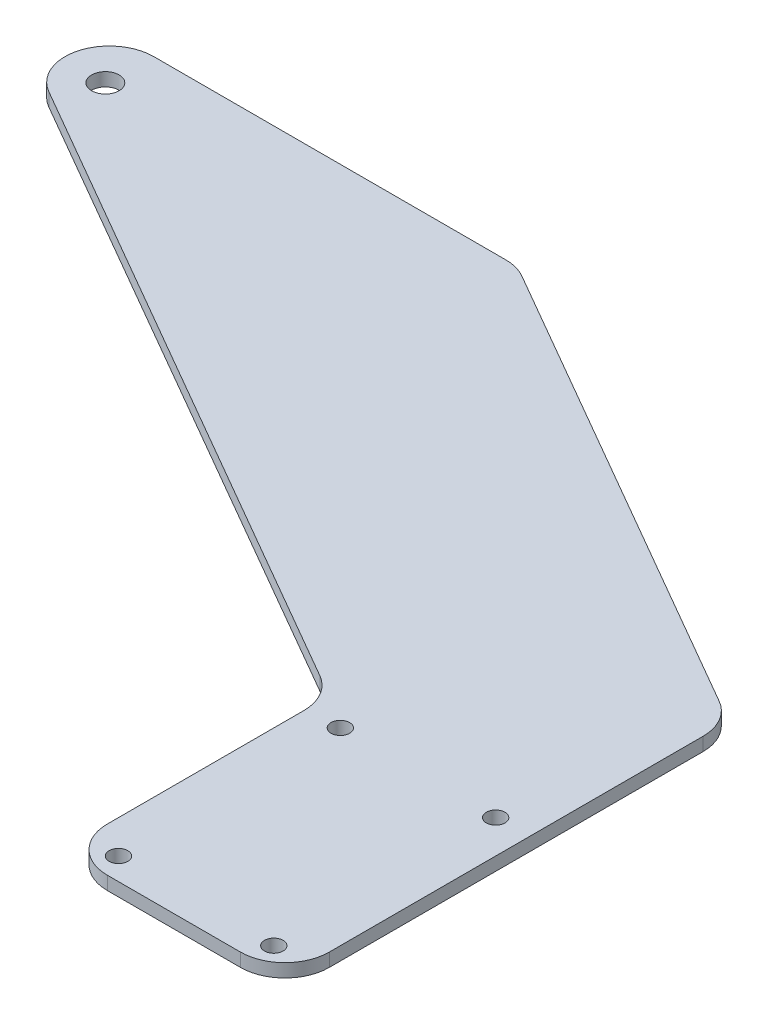
ISO-10303-21;
HEADER;
FILE_DESCRIPTION(('STEP AP214'),'2;1');
FILE_NAME('part.step','',(''),(''),'','','');
FILE_SCHEMA(('AUTOMOTIVE_DESIGN { 1 0 10303 214 1 1 1 1 }'));
ENDSEC;
DATA;
#1=APPLICATION_CONTEXT('core data for automotive mechanical design processes');
#2=APPLICATION_PROTOCOL_DEFINITION('international standard','automotive_design',2000,#1);
#3=PRODUCT_CONTEXT('',#1,'mechanical');
#4=PRODUCT('Part','Part','',(#3));
#5=PRODUCT_RELATED_PRODUCT_CATEGORY('part','',(#4));
#6=PRODUCT_DEFINITION_FORMATION('','',#4);
#7=PRODUCT_DEFINITION_CONTEXT('part definition',#1,'design');
#8=PRODUCT_DEFINITION('design','',#6,#7);
#9=PRODUCT_DEFINITION_SHAPE('','',#8);
#10=(LENGTH_UNIT() NAMED_UNIT(*) SI_UNIT(.MILLI.,.METRE.));
#11=(NAMED_UNIT(*) PLANE_ANGLE_UNIT() SI_UNIT($,.RADIAN.));
#12=(NAMED_UNIT(*) SI_UNIT($,.STERADIAN.) SOLID_ANGLE_UNIT());
#13=UNCERTAINTY_MEASURE_WITH_UNIT(LENGTH_MEASURE(1.E-05),#10,'distance_accuracy_value','');
#14=(GEOMETRIC_REPRESENTATION_CONTEXT(3) GLOBAL_UNCERTAINTY_ASSIGNED_CONTEXT((#13)) GLOBAL_UNIT_ASSIGNED_CONTEXT((#10,
#11,#12)) REPRESENTATION_CONTEXT('',''));
#15=CARTESIAN_POINT('',(0.,0.,0.));
#16=DIRECTION('',(0.,0.,1.));
#17=DIRECTION('',(1.,0.,0.));
#18=AXIS2_PLACEMENT_3D('',#15,#16,#17);
#19=CARTESIAN_POINT('',(1.28197512425567E-13,3.,-159.999999999999));
#20=DIRECTION('',(0.,0.,-1.));
#21=DIRECTION('',(-1.,0.,0.));
#22=AXIS2_PLACEMENT_3D('',#19,#20,#21);
#23=PLANE('',#22);
#24=DIRECTION('',(1.,0.,0.));
#25=VECTOR('',#24,1.);
#26=CARTESIAN_POINT('',(1.28197512425567E-13,3.,-159.999999999999));
#27=LINE('',#26,#25);
#28=CARTESIAN_POINT('',(-152.044826719044,3.,-159.999999999999));
#29=VERTEX_POINT('',#28);
#30=CARTESIAN_POINT('',(-72.7627944162897,3.,-159.999999999999));
#31=VERTEX_POINT('',#30);
#32=EDGE_CURVE('E254',#29,#31,#27,.T.);
#33=ORIENTED_EDGE('',*,*,#32,.T.);
#34=DIRECTION('',(0.,-1.,0.));
#35=VECTOR('',#34,1.);
#36=CARTESIAN_POINT('',(-72.7627944162897,0.,-159.999999999999));
#37=LINE('',#36,#35);
#38=CARTESIAN_POINT('',(-72.7627944162897,0.,-159.999999999999));
#39=VERTEX_POINT('',#38);
#40=EDGE_CURVE('E188',#31,#39,#37,.T.);
#41=ORIENTED_EDGE('',*,*,#40,.T.);
#42=DIRECTION('',(1.,0.,0.));
#43=VECTOR('',#42,1.);
#44=CARTESIAN_POINT('',(1.28197512425567E-13,0.,-159.999999999999));
#45=LINE('',#44,#43);
#46=CARTESIAN_POINT('',(-152.044826719044,0.,-159.999999999999));
#47=VERTEX_POINT('',#46);
#48=EDGE_CURVE('E235',#47,#39,#45,.T.);
#49=ORIENTED_EDGE('',*,*,#48,.F.);
#50=DIRECTION('',(0.,-1.,0.));
#51=VECTOR('',#50,1.);
#52=CARTESIAN_POINT('',(-152.044826719044,3.,-159.999999999999));
#53=LINE('',#52,#51);
#54=EDGE_CURVE('E186',#47,#29,#53,.F.);
#55=ORIENTED_EDGE('',*,*,#54,.T.);
#56=EDGE_LOOP('',(#33,#41,#49,#55));
#57=FACE_BOUND('',#56,.T.);
#58=ADVANCED_FACE('F37',(#57),#23,.T.);
#59=CARTESIAN_POINT('',(21.9406986040719,3.,-38.0024047358087));
#60=DIRECTION('',(-0.499999999999995,0.,0.866025403784442));
#61=DIRECTION('',(0.866025403784442,0.,0.499999999999995));
#62=AXIS2_PLACEMENT_3D('',#59,#60,#61);
#63=PLANE('',#62);
#64=DIRECTION('',(-0.866025403784442,0.,-0.499999999999995));
#65=VECTOR('',#64,1.);
#66=CARTESIAN_POINT('',(21.9406986040719,0.,-38.0024047358087));
#67=LINE('',#66,#65);
#68=CARTESIAN_POINT('',(-12.5000000000001,0.,-57.8867513459481));
#69=VERTEX_POINT('',#68);
#70=CARTESIAN_POINT('',(-157.044826719044,0.,-141.339745962155));
#71=VERTEX_POINT('',#70);
#72=EDGE_CURVE('E230',#69,#71,#67,.T.);
#73=ORIENTED_EDGE('',*,*,#72,.F.);
#74=DIRECTION('',(0.,-1.,0.));
#75=VECTOR('',#74,1.);
#76=CARTESIAN_POINT('',(-12.5000000000001,3.,-57.8867513459481));
#77=LINE('',#76,#75);
#78=CARTESIAN_POINT('',(-12.5000000000001,3.,-57.8867513459481));
#79=VERTEX_POINT('',#78);
#80=EDGE_CURVE('E184',#69,#79,#77,.F.);
#81=ORIENTED_EDGE('',*,*,#80,.T.);
#82=DIRECTION('',(-0.866025403784442,0.,-0.499999999999995));
#83=VECTOR('',#82,1.);
#84=CARTESIAN_POINT('',(21.9406986040719,3.,-38.0024047358087));
#85=LINE('',#84,#83);
#86=CARTESIAN_POINT('',(-157.044826719044,3.,-141.339745962155));
#87=VERTEX_POINT('',#86);
#88=EDGE_CURVE('E251',#79,#87,#85,.T.);
#89=ORIENTED_EDGE('',*,*,#88,.T.);
#90=DIRECTION('',(0.,-1.,0.));
#91=VECTOR('',#90,1.);
#92=CARTESIAN_POINT('',(-157.044826719044,3.,-141.339745962155));
#93=LINE('',#92,#91);
#94=EDGE_CURVE('E181',#87,#71,#93,.T.);
#95=ORIENTED_EDGE('',*,*,#94,.T.);
#96=EDGE_LOOP('',(#73,#81,#89,#95));
#97=FACE_BOUND('',#96,.T.);
#98=ADVANCED_FACE('F294',(#97),#63,.T.);
#99=CARTESIAN_POINT('',(-7.5,3.,0.));
#100=DIRECTION('',(-1.,0.,0.));
#101=DIRECTION('',(0.,0.,1.));
#102=AXIS2_PLACEMENT_3D('',#99,#100,#101);
#103=PLANE('',#102);
#104=DIRECTION('',(0.,0.,-1.));
#105=VECTOR('',#104,1.);
#106=CARTESIAN_POINT('',(-7.5,0.,0.));
#107=LINE('',#106,#105);
#108=CARTESIAN_POINT('',(-7.5,0.,-5.));
#109=VERTEX_POINT('',#108);
#110=CARTESIAN_POINT('',(-7.5,0.,-49.2264973081037));
#111=VERTEX_POINT('',#110);
#112=EDGE_CURVE('E229',#109,#111,#107,.T.);
#113=ORIENTED_EDGE('',*,*,#112,.F.);
#114=DIRECTION('',(0.,-1.,0.));
#115=VECTOR('',#114,1.);
#116=CARTESIAN_POINT('',(-7.5,3.,-5.));
#117=LINE('',#116,#115);
#118=CARTESIAN_POINT('',(-7.5,3.,-5.));
#119=VERTEX_POINT('',#118);
#120=EDGE_CURVE('E11',#109,#119,#117,.F.);
#121=ORIENTED_EDGE('',*,*,#120,.T.);
#122=DIRECTION('',(0.,0.,-1.));
#123=VECTOR('',#122,1.);
#124=CARTESIAN_POINT('',(-7.5,3.,0.));
#125=LINE('',#124,#123);
#126=CARTESIAN_POINT('',(-7.5,3.,-49.2264973081037));
#127=VERTEX_POINT('',#126);
#128=EDGE_CURVE('E249',#119,#127,#125,.T.);
#129=ORIENTED_EDGE('',*,*,#128,.T.);
#130=DIRECTION('',(0.,-1.,0.));
#131=VECTOR('',#130,1.);
#132=CARTESIAN_POINT('',(-7.5,0.,-49.2264973081037));
#133=LINE('',#132,#131);
#134=EDGE_CURVE('E178',#127,#111,#133,.T.);
#135=ORIENTED_EDGE('',*,*,#134,.T.);
#136=EDGE_LOOP('',(#113,#121,#129,#135));
#137=FACE_BOUND('',#136,.T.);
#138=ADVANCED_FACE('F300',(#137),#103,.T.);
#139=CARTESIAN_POINT('',(0.,3.,5.));
#140=DIRECTION('',(0.,0.,-1.));
#141=DIRECTION('',(-1.,0.,0.));
#142=AXIS2_PLACEMENT_3D('',#139,#140,#141);
#143=PLANE('',#142);
#144=DIRECTION('',(1.,0.,0.));
#145=VECTOR('',#144,1.);
#146=CARTESIAN_POINT('',(0.,0.,5.));
#147=LINE('',#146,#145);
#148=CARTESIAN_POINT('',(2.5,0.,5.));
#149=VERTEX_POINT('',#148);
#150=CARTESIAN_POINT('',(32.5,0.,4.99999999999999));
#151=VERTEX_POINT('',#150);
#152=EDGE_CURVE('E160',#149,#151,#147,.T.);
#153=ORIENTED_EDGE('',*,*,#152,.T.);
#154=DIRECTION('',(0.,-1.,0.));
#155=VECTOR('',#154,1.);
#156=CARTESIAN_POINT('',(32.5,3.,4.99999999999999));
#157=LINE('',#156,#155);
#158=CARTESIAN_POINT('',(32.5,3.,4.99999999999999));
#159=VERTEX_POINT('',#158);
#160=EDGE_CURVE('E58',#151,#159,#157,.F.);
#161=ORIENTED_EDGE('',*,*,#160,.T.);
#162=DIRECTION('',(1.,0.,0.));
#163=VECTOR('',#162,1.);
#164=CARTESIAN_POINT('',(0.,3.,5.));
#165=LINE('',#164,#163);
#166=CARTESIAN_POINT('',(2.5,3.,5.));
#167=VERTEX_POINT('',#166);
#168=EDGE_CURVE('E219',#167,#159,#165,.T.);
#169=ORIENTED_EDGE('',*,*,#168,.F.);
#170=DIRECTION('',(0.,-1.,0.));
#171=VECTOR('',#170,1.);
#172=CARTESIAN_POINT('',(2.5,0.,5.));
#173=LINE('',#172,#171);
#174=EDGE_CURVE('E208',#167,#149,#173,.T.);
#175=ORIENTED_EDGE('',*,*,#174,.T.);
#176=EDGE_LOOP('',(#153,#161,#169,#175));
#177=FACE_BOUND('',#176,.T.);
#178=ADVANCED_FACE('F227',(#177),#143,.F.);
#179=CARTESIAN_POINT('',(42.5,3.,0.));
#180=DIRECTION('',(-1.,0.,0.));
#181=DIRECTION('',(0.,0.,1.));
#182=AXIS2_PLACEMENT_3D('',#179,#180,#181);
#183=PLANE('',#182);
#184=DIRECTION('',(0.,0.,-1.));
#185=VECTOR('',#184,1.);
#186=CARTESIAN_POINT('',(42.5,3.,0.));
#187=LINE('',#186,#185);
#188=CARTESIAN_POINT('',(42.5,3.,-5.00000000000001));
#189=VERTEX_POINT('',#188);
#190=CARTESIAN_POINT('',(42.5,3.,-89.226497308104));
#191=VERTEX_POINT('',#190);
#192=EDGE_CURVE('E218',#189,#191,#187,.T.);
#193=ORIENTED_EDGE('',*,*,#192,.F.);
#194=DIRECTION('',(0.,-1.,0.));
#195=VECTOR('',#194,1.);
#196=CARTESIAN_POINT('',(42.5,3.,-5.00000000000001));
#197=LINE('',#196,#195);
#198=CARTESIAN_POINT('',(42.5,0.,-5.00000000000001));
#199=VERTEX_POINT('',#198);
#200=EDGE_CURVE('E196',#189,#199,#197,.T.);
#201=ORIENTED_EDGE('',*,*,#200,.T.);
#202=DIRECTION('',(0.,0.,-1.));
#203=VECTOR('',#202,1.);
#204=CARTESIAN_POINT('',(42.5,0.,0.));
#205=LINE('',#204,#203);
#206=CARTESIAN_POINT('',(42.5,0.,-89.226497308104));
#207=VERTEX_POINT('',#206);
#208=EDGE_CURVE('E155',#199,#207,#205,.T.);
#209=ORIENTED_EDGE('',*,*,#208,.T.);
#210=DIRECTION('',(0.,-1.,0.));
#211=VECTOR('',#210,1.);
#212=CARTESIAN_POINT('',(42.5,3.,-89.226497308104));
#213=LINE('',#212,#211);
#214=EDGE_CURVE('E134',#207,#191,#213,.F.);
#215=ORIENTED_EDGE('',*,*,#214,.T.);
#216=EDGE_LOOP('',(#193,#201,#209,#215));
#217=FACE_BOUND('',#216,.T.);
#218=ADVANCED_FACE('F223',(#217),#183,.F.);
#219=CARTESIAN_POINT('',(35.,3.,0.));
#220=DIRECTION('',(0.,-1.,0.));
#221=DIRECTION('',(0.,0.,-1.));
#222=AXIS2_PLACEMENT_3D('',#219,#220,#221);
#223=CYLINDRICAL_SURFACE('',#222,2.1);
#224=CARTESIAN_POINT('',(35.,3.,0.));
#225=DIRECTION('',(0.,1.,0.));
#226=DIRECTION('',(0.,0.,1.));
#227=AXIS2_PLACEMENT_3D('',#224,#225,#226);
#228=CIRCLE('',#227,2.1);
#229=CARTESIAN_POINT('',(35.,3.,2.1));
#230=VERTEX_POINT('',#229);
#231=EDGE_CURVE('E244',#230,#230,#228,.T.);
#232=ORIENTED_EDGE('',*,*,#231,.T.);
#233=EDGE_LOOP('',(#232));
#234=FACE_BOUND('',#233,.T.);
#235=CARTESIAN_POINT('',(35.,0.,0.));
#236=DIRECTION('',(0.,1.,0.));
#237=DIRECTION('',(0.,0.,1.));
#238=AXIS2_PLACEMENT_3D('',#235,#236,#237);
#239=CIRCLE('',#238,2.1);
#240=CARTESIAN_POINT('',(35.,0.,2.1));
#241=VERTEX_POINT('',#240);
#242=EDGE_CURVE('E154',#241,#241,#239,.T.);
#243=ORIENTED_EDGE('',*,*,#242,.F.);
#244=EDGE_LOOP('',(#243));
#245=FACE_BOUND('',#244,.T.);
#246=ADVANCED_FACE('F354',(#234,#245),#223,.F.);
#247=CARTESIAN_POINT('',(51.7612066797599,3.,-89.6530398304203));
#248=DIRECTION('',(-0.499999999999989,0.,0.866025403784445));
#249=DIRECTION('',(0.866025403784445,0.,0.499999999999989));
#250=AXIS2_PLACEMENT_3D('',#247,#248,#249);
#251=PLANE('',#250);
#252=DIRECTION('',(-0.866025403784445,0.,-0.499999999999989));
#253=VECTOR('',#252,1.);
#254=CARTESIAN_POINT('',(51.7612066797599,3.,-89.6530398304203));
#255=LINE('',#254,#253);
#256=CARTESIAN_POINT('',(37.4999999999999,3.,-97.8867513459484));
#257=VERTEX_POINT('',#256);
#258=CARTESIAN_POINT('',(-67.7627944162898,3.,-158.660254037844));
#259=VERTEX_POINT('',#258);
#260=EDGE_CURVE('E147',#257,#259,#255,.T.);
#261=ORIENTED_EDGE('',*,*,#260,.F.);
#262=DIRECTION('',(0.,-1.,0.));
#263=VECTOR('',#262,1.);
#264=CARTESIAN_POINT('',(37.4999999999999,3.,-97.8867513459484));
#265=LINE('',#264,#263);
#266=CARTESIAN_POINT('',(37.4999999999999,0.,-97.8867513459484));
#267=VERTEX_POINT('',#266);
#268=EDGE_CURVE('E132',#257,#267,#265,.T.);
#269=ORIENTED_EDGE('',*,*,#268,.T.);
#270=DIRECTION('',(-0.866025403784445,0.,-0.499999999999989));
#271=VECTOR('',#270,1.);
#272=CARTESIAN_POINT('',(51.7612066797599,0.,-89.6530398304203));
#273=LINE('',#272,#271);
#274=CARTESIAN_POINT('',(-67.7627944162898,0.,-158.660254037844));
#275=VERTEX_POINT('',#274);
#276=EDGE_CURVE('E144',#267,#275,#273,.T.);
#277=ORIENTED_EDGE('',*,*,#276,.T.);
#278=DIRECTION('',(0.,-1.,0.));
#279=VECTOR('',#278,1.);
#280=CARTESIAN_POINT('',(-67.7627944162898,3.,-158.660254037844));
#281=LINE('',#280,#279);
#282=EDGE_CURVE('E149',#275,#259,#281,.F.);
#283=ORIENTED_EDGE('',*,*,#282,.T.);
#284=EDGE_LOOP('',(#261,#269,#277,#283));
#285=FACE_BOUND('',#284,.T.);
#286=ADVANCED_FACE('F143',(#285),#251,.F.);
#287=CARTESIAN_POINT('',(0.,3.,-50.));
#288=DIRECTION('',(0.,-1.,0.));
#289=DIRECTION('',(0.,0.,-1.));
#290=AXIS2_PLACEMENT_3D('',#287,#288,#289);
#291=CYLINDRICAL_SURFACE('',#290,2.1);
#292=CARTESIAN_POINT('',(0.,3.,-50.));
#293=DIRECTION('',(0.,1.,0.));
#294=DIRECTION('',(0.,0.,1.));
#295=AXIS2_PLACEMENT_3D('',#292,#293,#294);
#296=CIRCLE('',#295,2.1);
#297=CARTESIAN_POINT('',(0.,3.,-47.9));
#298=VERTEX_POINT('',#297);
#299=EDGE_CURVE('E257',#298,#298,#296,.T.);
#300=ORIENTED_EDGE('',*,*,#299,.T.);
#301=EDGE_LOOP('',(#300));
#302=FACE_BOUND('',#301,.T.);
#303=CARTESIAN_POINT('',(0.,0.,-50.));
#304=DIRECTION('',(0.,1.,0.));
#305=DIRECTION('',(0.,0.,1.));
#306=AXIS2_PLACEMENT_3D('',#303,#304,#305);
#307=CIRCLE('',#306,2.1);
#308=CARTESIAN_POINT('',(0.,0.,-47.9));
#309=VERTEX_POINT('',#308);
#310=EDGE_CURVE('E237',#309,#309,#307,.T.);
#311=ORIENTED_EDGE('',*,*,#310,.F.);
#312=EDGE_LOOP('',(#311));
#313=FACE_BOUND('',#312,.T.);
#314=ADVANCED_FACE('F276',(#302,#313),#291,.F.);
#315=CARTESIAN_POINT('',(35.,3.,-50.));
#316=DIRECTION('',(0.,-1.,0.));
#317=DIRECTION('',(0.,0.,-1.));
#318=AXIS2_PLACEMENT_3D('',#315,#316,#317);
#319=CYLINDRICAL_SURFACE('',#318,2.1);
#320=CARTESIAN_POINT('',(35.,3.,-50.));
#321=DIRECTION('',(0.,1.,0.));
#322=DIRECTION('',(0.,0.,1.));
#323=AXIS2_PLACEMENT_3D('',#320,#321,#322);
#324=CIRCLE('',#323,2.1);
#325=CARTESIAN_POINT('',(35.,3.,-47.9));
#326=VERTEX_POINT('',#325);
#327=EDGE_CURVE('E166',#326,#326,#324,.F.);
#328=ORIENTED_EDGE('',*,*,#327,.F.);
#329=EDGE_LOOP('',(#328));
#330=FACE_BOUND('',#329,.T.);
#331=CARTESIAN_POINT('',(35.,0.,-50.));
#332=DIRECTION('',(0.,1.,0.));
#333=DIRECTION('',(0.,0.,1.));
#334=AXIS2_PLACEMENT_3D('',#331,#332,#333);
#335=CIRCLE('',#334,2.1);
#336=CARTESIAN_POINT('',(35.,0.,-47.9));
#337=VERTEX_POINT('',#336);
#338=EDGE_CURVE('E200',#337,#337,#335,.F.);
#339=ORIENTED_EDGE('',*,*,#338,.T.);
#340=EDGE_LOOP('',(#339));
#341=FACE_BOUND('',#340,.T.);
#342=ADVANCED_FACE('F279',(#330,#341),#319,.F.);
#343=CARTESIAN_POINT('',(0.,3.,0.));
#344=DIRECTION('',(0.,-1.,0.));
#345=DIRECTION('',(0.,0.,-1.));
#346=AXIS2_PLACEMENT_3D('',#343,#344,#345);
#347=CYLINDRICAL_SURFACE('',#346,2.1);
#348=CARTESIAN_POINT('',(0.,3.,0.));
#349=DIRECTION('',(0.,1.,0.));
#350=DIRECTION('',(0.,0.,1.));
#351=AXIS2_PLACEMENT_3D('',#348,#349,#350);
#352=CIRCLE('',#351,2.1);
#353=CARTESIAN_POINT('',(0.,3.,2.1));
#354=VERTEX_POINT('',#353);
#355=EDGE_CURVE('E167',#354,#354,#352,.F.);
#356=ORIENTED_EDGE('',*,*,#355,.F.);
#357=EDGE_LOOP('',(#356));
#358=FACE_BOUND('',#357,.T.);
#359=CARTESIAN_POINT('',(0.,0.,0.));
#360=DIRECTION('',(0.,1.,0.));
#361=DIRECTION('',(0.,0.,1.));
#362=AXIS2_PLACEMENT_3D('',#359,#360,#361);
#363=CIRCLE('',#362,2.1);
#364=CARTESIAN_POINT('',(0.,0.,2.1));
#365=VERTEX_POINT('',#364);
#366=EDGE_CURVE('E158',#365,#365,#363,.F.);
#367=ORIENTED_EDGE('',*,*,#366,.T.);
#368=EDGE_LOOP('',(#367));
#369=FACE_BOUND('',#368,.T.);
#370=ADVANCED_FACE('F270',(#358,#369),#347,.F.);
#371=CARTESIAN_POINT('',(0.,3.,0.));
#372=DIRECTION('',(0.,1.,0.));
#373=DIRECTION('',(0.,0.,1.));
#374=AXIS2_PLACEMENT_3D('',#371,#372,#373);
#375=PLANE('',#374);
#376=CARTESIAN_POINT('',(-152.379763209583,3.,-149.419872981077));
#377=DIRECTION('',(0.,1.,0.));
#378=DIRECTION('',(0.,0.,1.));
#379=AXIS2_PLACEMENT_3D('',#376,#377,#378);
#380=CIRCLE('',#379,3.09999999999999);
#381=CARTESIAN_POINT('',(-152.379763209583,3.,-146.319872981077));
#382=VERTEX_POINT('',#381);
#383=EDGE_CURVE('E201',#382,#382,#380,.T.);
#384=ORIENTED_EDGE('',*,*,#383,.F.);
#385=EDGE_LOOP('',(#384));
#386=FACE_BOUND('',#385,.T.);
#387=ORIENTED_EDGE('',*,*,#327,.T.);
#388=EDGE_LOOP('',(#387));
#389=FACE_BOUND('',#388,.T.);
#390=ORIENTED_EDGE('',*,*,#299,.F.);
#391=EDGE_LOOP('',(#390));
#392=FACE_BOUND('',#391,.T.);
#393=ORIENTED_EDGE('',*,*,#168,.T.);
#394=CARTESIAN_POINT('',(32.5,3.,-5.));
#395=DIRECTION('',(0.,1.,0.));
#396=DIRECTION('',(0.,0.,1.));
#397=AXIS2_PLACEMENT_3D('',#394,#395,#396);
#398=CIRCLE('',#397,10.);
#399=EDGE_CURVE('E45',#159,#189,#398,.T.);
#400=ORIENTED_EDGE('',*,*,#399,.T.);
#401=ORIENTED_EDGE('',*,*,#192,.T.);
#402=CARTESIAN_POINT('',(32.5,3.,-89.226497308104));
#403=DIRECTION('',(0.,1.,0.));
#404=DIRECTION('',(0.,0.,1.));
#405=AXIS2_PLACEMENT_3D('',#402,#403,#404);
#406=CIRCLE('',#405,10.);
#407=EDGE_CURVE('E176',#191,#257,#406,.T.);
#408=ORIENTED_EDGE('',*,*,#407,.T.);
#409=ORIENTED_EDGE('',*,*,#260,.T.);
#410=CARTESIAN_POINT('',(-72.7627944162897,3.,-149.999999999999));
#411=DIRECTION('',(0.,1.,0.));
#412=DIRECTION('',(0.,0.,1.));
#413=AXIS2_PLACEMENT_3D('',#410,#411,#412);
#414=CIRCLE('',#413,10.);
#415=EDGE_CURVE('E174',#259,#31,#414,.T.);
#416=ORIENTED_EDGE('',*,*,#415,.T.);
#417=ORIENTED_EDGE('',*,*,#32,.F.);
#418=CARTESIAN_POINT('',(-152.044826719044,3.,-149.999999999999));
#419=DIRECTION('',(0.,1.,0.));
#420=DIRECTION('',(0.,0.,1.));
#421=AXIS2_PLACEMENT_3D('',#418,#419,#420);
#422=CIRCLE('',#421,10.);
#423=EDGE_CURVE('E172',#29,#87,#422,.T.);
#424=ORIENTED_EDGE('',*,*,#423,.T.);
#425=ORIENTED_EDGE('',*,*,#88,.F.);
#426=CARTESIAN_POINT('',(-17.5,3.,-49.2264973081037));
#427=DIRECTION('',(0.,1.,0.));
#428=DIRECTION('',(0.,0.,1.));
#429=AXIS2_PLACEMENT_3D('',#426,#427,#428);
#430=CIRCLE('',#429,10.);
#431=EDGE_CURVE('E193',#79,#127,#430,.F.);
#432=ORIENTED_EDGE('',*,*,#431,.T.);
#433=ORIENTED_EDGE('',*,*,#128,.F.);
#434=CARTESIAN_POINT('',(2.5,3.,-5.));
#435=DIRECTION('',(0.,1.,0.));
#436=DIRECTION('',(0.,0.,1.));
#437=AXIS2_PLACEMENT_3D('',#434,#435,#436);
#438=CIRCLE('',#437,10.);
#439=EDGE_CURVE('E212',#119,#167,#438,.T.);
#440=ORIENTED_EDGE('',*,*,#439,.T.);
#441=EDGE_LOOP('',(#393,#400,#401,#408,#409,#416,#417,#424,#425,#432,#433,#440));
#442=FACE_BOUND('',#441,.T.);
#443=ORIENTED_EDGE('',*,*,#231,.F.);
#444=EDGE_LOOP('',(#443));
#445=FACE_BOUND('',#444,.T.);
#446=ORIENTED_EDGE('',*,*,#355,.T.);
#447=EDGE_LOOP('',(#446));
#448=FACE_BOUND('',#447,.T.);
#449=ADVANCED_FACE('F216',(#386,#389,#392,#442,#445,#448),#375,.T.);
#450=CARTESIAN_POINT('',(0.,0.,0.));
#451=DIRECTION('',(0.,1.,0.));
#452=DIRECTION('',(0.,0.,1.));
#453=AXIS2_PLACEMENT_3D('',#450,#451,#452);
#454=PLANE('',#453);
#455=CARTESIAN_POINT('',(-152.379763209583,0.,-149.419872981077));
#456=DIRECTION('',(0.,1.,0.));
#457=DIRECTION('',(0.,0.,1.));
#458=AXIS2_PLACEMENT_3D('',#455,#456,#457);
#459=CIRCLE('',#458,3.09999999999999);
#460=CARTESIAN_POINT('',(-152.379763209583,0.,-146.319872981077));
#461=VERTEX_POINT('',#460);
#462=EDGE_CURVE('E197',#461,#461,#459,.T.);
#463=ORIENTED_EDGE('',*,*,#462,.T.);
#464=EDGE_LOOP('',(#463));
#465=FACE_BOUND('',#464,.T.);
#466=ORIENTED_EDGE('',*,*,#338,.F.);
#467=EDGE_LOOP('',(#466));
#468=FACE_BOUND('',#467,.T.);
#469=ORIENTED_EDGE('',*,*,#310,.T.);
#470=EDGE_LOOP('',(#469));
#471=FACE_BOUND('',#470,.T.);
#472=ORIENTED_EDGE('',*,*,#208,.F.);
#473=CARTESIAN_POINT('',(32.5,0.,-5.));
#474=DIRECTION('',(0.,1.,0.));
#475=DIRECTION('',(0.,0.,1.));
#476=AXIS2_PLACEMENT_3D('',#473,#474,#475);
#477=CIRCLE('',#476,10.);
#478=EDGE_CURVE('E206',#199,#151,#477,.F.);
#479=ORIENTED_EDGE('',*,*,#478,.T.);
#480=ORIENTED_EDGE('',*,*,#152,.F.);
#481=CARTESIAN_POINT('',(2.5,0.,-5.));
#482=DIRECTION('',(0.,1.,0.));
#483=DIRECTION('',(0.,0.,1.));
#484=AXIS2_PLACEMENT_3D('',#481,#482,#483);
#485=CIRCLE('',#484,10.);
#486=EDGE_CURVE('E204',#149,#109,#485,.F.);
#487=ORIENTED_EDGE('',*,*,#486,.T.);
#488=ORIENTED_EDGE('',*,*,#112,.T.);
#489=CARTESIAN_POINT('',(-17.5,0.,-49.2264973081037));
#490=DIRECTION('',(0.,1.,0.));
#491=DIRECTION('',(0.,0.,1.));
#492=AXIS2_PLACEMENT_3D('',#489,#490,#491);
#493=CIRCLE('',#492,10.);
#494=EDGE_CURVE('E191',#111,#69,#493,.T.);
#495=ORIENTED_EDGE('',*,*,#494,.T.);
#496=ORIENTED_EDGE('',*,*,#72,.T.);
#497=CARTESIAN_POINT('',(-152.044826719044,0.,-149.999999999999));
#498=DIRECTION('',(0.,1.,0.));
#499=DIRECTION('',(0.,0.,1.));
#500=AXIS2_PLACEMENT_3D('',#497,#498,#499);
#501=CIRCLE('',#500,10.);
#502=EDGE_CURVE('E148',#71,#47,#501,.F.);
#503=ORIENTED_EDGE('',*,*,#502,.T.);
#504=ORIENTED_EDGE('',*,*,#48,.T.);
#505=CARTESIAN_POINT('',(-72.7627944162897,0.,-149.999999999999));
#506=DIRECTION('',(0.,1.,0.));
#507=DIRECTION('',(0.,0.,1.));
#508=AXIS2_PLACEMENT_3D('',#505,#506,#507);
#509=CIRCLE('',#508,10.);
#510=EDGE_CURVE('E138',#39,#275,#509,.F.);
#511=ORIENTED_EDGE('',*,*,#510,.T.);
#512=ORIENTED_EDGE('',*,*,#276,.F.);
#513=CARTESIAN_POINT('',(32.5,0.,-89.226497308104));
#514=DIRECTION('',(0.,1.,0.));
#515=DIRECTION('',(0.,0.,1.));
#516=AXIS2_PLACEMENT_3D('',#513,#514,#515);
#517=CIRCLE('',#516,10.);
#518=EDGE_CURVE('E128',#267,#207,#517,.F.);
#519=ORIENTED_EDGE('',*,*,#518,.T.);
#520=EDGE_LOOP('',(#472,#479,#480,#487,#488,#495,#496,#503,#504,#511,#512,#519));
#521=FACE_BOUND('',#520,.T.);
#522=ORIENTED_EDGE('',*,*,#242,.T.);
#523=EDGE_LOOP('',(#522));
#524=FACE_BOUND('',#523,.T.);
#525=ORIENTED_EDGE('',*,*,#366,.F.);
#526=EDGE_LOOP('',(#525));
#527=FACE_BOUND('',#526,.T.);
#528=ADVANCED_FACE('F151',(#465,#468,#471,#521,#524,#527),#454,.F.);
#529=CARTESIAN_POINT('',(32.5,3.,-89.226497308104));
#530=DIRECTION('',(0.,-1.,0.));
#531=DIRECTION('',(0.,0.,-1.));
#532=AXIS2_PLACEMENT_3D('',#529,#530,#531);
#533=CYLINDRICAL_SURFACE('',#532,10.);
#534=ORIENTED_EDGE('',*,*,#407,.F.);
#535=ORIENTED_EDGE('',*,*,#214,.F.);
#536=ORIENTED_EDGE('',*,*,#518,.F.);
#537=ORIENTED_EDGE('',*,*,#268,.F.);
#538=EDGE_LOOP('',(#534,#535,#536,#537));
#539=FACE_BOUND('',#538,.T.);
#540=ADVANCED_FACE('F131',(#539),#533,.T.);
#541=CARTESIAN_POINT('',(-17.5,3.,-49.2264973081037));
#542=DIRECTION('',(0.,1.,0.));
#543=DIRECTION('',(0.,0.,1.));
#544=AXIS2_PLACEMENT_3D('',#541,#542,#543);
#545=CYLINDRICAL_SURFACE('',#544,10.);
#546=ORIENTED_EDGE('',*,*,#431,.F.);
#547=ORIENTED_EDGE('',*,*,#80,.F.);
#548=ORIENTED_EDGE('',*,*,#494,.F.);
#549=ORIENTED_EDGE('',*,*,#134,.F.);
#550=EDGE_LOOP('',(#546,#547,#548,#549));
#551=FACE_BOUND('',#550,.T.);
#552=ADVANCED_FACE('F289',(#551),#545,.F.);
#553=CARTESIAN_POINT('',(-72.7627944162897,3.,-149.999999999999));
#554=DIRECTION('',(0.,1.,0.));
#555=DIRECTION('',(0.,0.,1.));
#556=AXIS2_PLACEMENT_3D('',#553,#554,#555);
#557=CYLINDRICAL_SURFACE('',#556,10.);
#558=ORIENTED_EDGE('',*,*,#415,.F.);
#559=ORIENTED_EDGE('',*,*,#282,.F.);
#560=ORIENTED_EDGE('',*,*,#510,.F.);
#561=ORIENTED_EDGE('',*,*,#40,.F.);
#562=EDGE_LOOP('',(#558,#559,#560,#561));
#563=FACE_BOUND('',#562,.T.);
#564=ADVANCED_FACE('F310',(#563),#557,.T.);
#565=CARTESIAN_POINT('',(-152.044826719044,3.,-149.999999999999));
#566=DIRECTION('',(0.,-1.,0.));
#567=DIRECTION('',(0.,0.,-1.));
#568=AXIS2_PLACEMENT_3D('',#565,#566,#567);
#569=CYLINDRICAL_SURFACE('',#568,10.);
#570=ORIENTED_EDGE('',*,*,#423,.F.);
#571=ORIENTED_EDGE('',*,*,#54,.F.);
#572=ORIENTED_EDGE('',*,*,#502,.F.);
#573=ORIENTED_EDGE('',*,*,#94,.F.);
#574=EDGE_LOOP('',(#570,#571,#572,#573));
#575=FACE_BOUND('',#574,.T.);
#576=ADVANCED_FACE('F314',(#575),#569,.T.);
#577=CARTESIAN_POINT('',(-152.379763209583,-7.,-149.419872981077));
#578=DIRECTION('',(0.,1.,0.));
#579=DIRECTION('',(0.,0.,1.));
#580=AXIS2_PLACEMENT_3D('',#577,#578,#579);
#581=CYLINDRICAL_SURFACE('',#580,3.09999999999999);
#582=ORIENTED_EDGE('',*,*,#383,.T.);
#583=EDGE_LOOP('',(#582));
#584=FACE_BOUND('',#583,.T.);
#585=ORIENTED_EDGE('',*,*,#462,.F.);
#586=EDGE_LOOP('',(#585));
#587=FACE_BOUND('',#586,.T.);
#588=ADVANCED_FACE('F265',(#584,#587),#581,.F.);
#589=CARTESIAN_POINT('',(32.5,3.,-5.));
#590=DIRECTION('',(0.,-1.,0.));
#591=DIRECTION('',(0.,0.,-1.));
#592=AXIS2_PLACEMENT_3D('',#589,#590,#591);
#593=CYLINDRICAL_SURFACE('',#592,10.);
#594=ORIENTED_EDGE('',*,*,#399,.F.);
#595=ORIENTED_EDGE('',*,*,#160,.F.);
#596=ORIENTED_EDGE('',*,*,#478,.F.);
#597=ORIENTED_EDGE('',*,*,#200,.F.);
#598=EDGE_LOOP('',(#594,#595,#596,#597));
#599=FACE_BOUND('',#598,.T.);
#600=ADVANCED_FACE('F225',(#599),#593,.T.);
#601=CARTESIAN_POINT('',(2.5,3.,-5.));
#602=DIRECTION('',(0.,1.,0.));
#603=DIRECTION('',(0.,0.,1.));
#604=AXIS2_PLACEMENT_3D('',#601,#602,#603);
#605=CYLINDRICAL_SURFACE('',#604,10.);
#606=ORIENTED_EDGE('',*,*,#439,.F.);
#607=ORIENTED_EDGE('',*,*,#120,.F.);
#608=ORIENTED_EDGE('',*,*,#486,.F.);
#609=ORIENTED_EDGE('',*,*,#174,.F.);
#610=EDGE_LOOP('',(#606,#607,#608,#609));
#611=FACE_BOUND('',#610,.T.);
#612=ADVANCED_FACE('F39',(#611),#605,.T.);
#613=CLOSED_SHELL('',(#58,#98,#138,#178,#218,#246,#286,#314,#342,#370,#449,#528,#540,#552,#564,
#576,#588,#600,#612));
#614=MANIFOLD_SOLID_BREP('B2',#613);
#615=ADVANCED_BREP_SHAPE_REPRESENTATION('',(#18,#614),#14);
#616=SHAPE_DEFINITION_REPRESENTATION(#9,#615);
ENDSEC;
END-ISO-10303-21;
